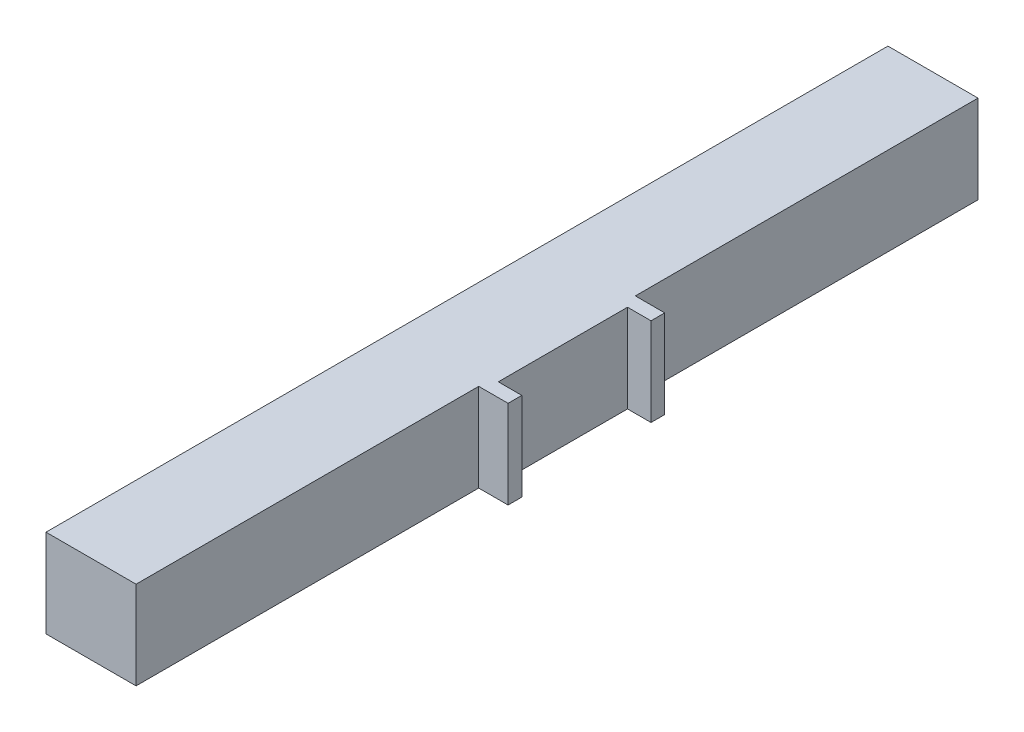
ISO-10303-21;
HEADER;
FILE_DESCRIPTION(('STEP AP214'),'2;1');
FILE_NAME('part.step','',(''),(''),'','','');
FILE_SCHEMA(('AUTOMOTIVE_DESIGN { 1 0 10303 214 1 1 1 1 }'));
ENDSEC;
DATA;
#1=APPLICATION_CONTEXT('core data for automotive mechanical design processes');
#2=APPLICATION_PROTOCOL_DEFINITION('international standard','automotive_design',2000,#1);
#3=PRODUCT_CONTEXT('',#1,'mechanical');
#4=PRODUCT('Part','Part','',(#3));
#5=PRODUCT_RELATED_PRODUCT_CATEGORY('part','',(#4));
#6=PRODUCT_DEFINITION_FORMATION('','',#4);
#7=PRODUCT_DEFINITION_CONTEXT('part definition',#1,'design');
#8=PRODUCT_DEFINITION('design','',#6,#7);
#9=PRODUCT_DEFINITION_SHAPE('','',#8);
#10=(LENGTH_UNIT() NAMED_UNIT(*) SI_UNIT(.MILLI.,.METRE.));
#11=(NAMED_UNIT(*) PLANE_ANGLE_UNIT() SI_UNIT($,.RADIAN.));
#12=(NAMED_UNIT(*) SI_UNIT($,.STERADIAN.) SOLID_ANGLE_UNIT());
#13=UNCERTAINTY_MEASURE_WITH_UNIT(LENGTH_MEASURE(1.E-05),#10,'distance_accuracy_value','');
#14=(GEOMETRIC_REPRESENTATION_CONTEXT(3) GLOBAL_UNCERTAINTY_ASSIGNED_CONTEXT((#13)) GLOBAL_UNIT_ASSIGNED_CONTEXT((#10,
#11,#12)) REPRESENTATION_CONTEXT('',''));
#15=CARTESIAN_POINT('',(0.,0.,0.));
#16=DIRECTION('',(0.,0.,1.));
#17=DIRECTION('',(1.,0.,0.));
#18=AXIS2_PLACEMENT_3D('',#15,#16,#17);
#19=CARTESIAN_POINT('',(38.,0.,0.));
#20=DIRECTION('',(1.,0.,0.));
#21=DIRECTION('',(0.,1.,0.));
#22=AXIS2_PLACEMENT_3D('',#19,#20,#21);
#23=PLANE('',#22);
#24=DIRECTION('',(0.,1.,0.));
#25=VECTOR('',#24,1.);
#26=CARTESIAN_POINT('',(38.,0.,182.));
#27=LINE('',#26,#25);
#28=CARTESIAN_POINT('',(38.,-22.5,182.));
#29=VERTEX_POINT('',#28);
#30=CARTESIAN_POINT('',(38.,22.5,182.));
#31=VERTEX_POINT('',#30);
#32=EDGE_CURVE('E48',#29,#31,#27,.T.);
#33=ORIENTED_EDGE('',*,*,#32,.F.);
#34=DIRECTION('',(0.,0.,-1.));
#35=VECTOR('',#34,1.);
#36=CARTESIAN_POINT('',(38.,-22.5,0.));
#37=LINE('',#36,#35);
#38=CARTESIAN_POINT('',(38.,-22.5,175.));
#39=VERTEX_POINT('',#38);
#40=EDGE_CURVE('E162',#29,#39,#37,.T.);
#41=ORIENTED_EDGE('',*,*,#40,.T.);
#42=DIRECTION('',(0.,-1.,0.));
#43=VECTOR('',#42,1.);
#44=CARTESIAN_POINT('',(38.,0.,175.));
#45=LINE('',#44,#43);
#46=CARTESIAN_POINT('',(38.,22.5,175.));
#47=VERTEX_POINT('',#46);
#48=EDGE_CURVE('E166',#47,#39,#45,.T.);
#49=ORIENTED_EDGE('',*,*,#48,.F.);
#50=DIRECTION('',(0.,0.,1.));
#51=VECTOR('',#50,1.);
#52=CARTESIAN_POINT('',(38.,22.5,0.));
#53=LINE('',#52,#51);
#54=EDGE_CURVE('E157',#47,#31,#53,.T.);
#55=ORIENTED_EDGE('',*,*,#54,.T.);
#56=EDGE_LOOP('',(#33,#41,#49,#55));
#57=FACE_BOUND('',#56,.T.);
#58=ADVANCED_FACE('F40',(#57),#23,.T.);
#59=CARTESIAN_POINT('',(23.,22.5,430.));
#60=DIRECTION('',(-1.,0.,0.));
#61=DIRECTION('',(0.,-1.,0.));
#62=AXIS2_PLACEMENT_3D('',#59,#60,#61);
#63=PLANE('',#62);
#64=DIRECTION('',(0.,-1.,0.));
#65=VECTOR('',#64,1.);
#66=CARTESIAN_POINT('',(23.,0.,255.));
#67=LINE('',#66,#65);
#68=CARTESIAN_POINT('',(23.,22.5,255.));
#69=VERTEX_POINT('',#68);
#70=CARTESIAN_POINT('',(23.,-22.5,255.));
#71=VERTEX_POINT('',#70);
#72=EDGE_CURVE('E156',#69,#71,#67,.T.);
#73=ORIENTED_EDGE('',*,*,#72,.F.);
#74=DIRECTION('',(0.,0.,-1.));
#75=VECTOR('',#74,1.);
#76=CARTESIAN_POINT('',(23.,22.5,430.));
#77=LINE('',#76,#75);
#78=CARTESIAN_POINT('',(23.,22.5,430.));
#79=VERTEX_POINT('',#78);
#80=EDGE_CURVE('E213',#79,#69,#77,.T.);
#81=ORIENTED_EDGE('',*,*,#80,.F.);
#82=DIRECTION('',(0.,1.,0.));
#83=VECTOR('',#82,1.);
#84=CARTESIAN_POINT('',(23.,22.5,430.));
#85=LINE('',#84,#83);
#86=CARTESIAN_POINT('',(23.,-22.5,430.));
#87=VERTEX_POINT('',#86);
#88=EDGE_CURVE('E185',#87,#79,#85,.T.);
#89=ORIENTED_EDGE('',*,*,#88,.F.);
#90=DIRECTION('',(0.,0.,-1.));
#91=VECTOR('',#90,1.);
#92=CARTESIAN_POINT('',(23.,-22.5,430.));
#93=LINE('',#92,#91);
#94=EDGE_CURVE('E204',#87,#71,#93,.T.);
#95=ORIENTED_EDGE('',*,*,#94,.T.);
#96=EDGE_LOOP('',(#73,#81,#89,#95));
#97=FACE_BOUND('',#96,.T.);
#98=ADVANCED_FACE('F247',(#97),#63,.F.);
#99=CARTESIAN_POINT('',(23.,22.5,175.));
#100=VERTEX_POINT('',#99);
#101=CARTESIAN_POINT('',(23.,22.5,0.));
#102=VERTEX_POINT('',#101);
#103=EDGE_CURVE('E212',#100,#102,#77,.T.);
#104=ORIENTED_EDGE('',*,*,#103,.F.);
#105=DIRECTION('',(0.,-1.,0.));
#106=VECTOR('',#105,1.);
#107=CARTESIAN_POINT('',(23.,0.,175.));
#108=LINE('',#107,#106);
#109=CARTESIAN_POINT('',(23.,-22.5,175.));
#110=VERTEX_POINT('',#109);
#111=EDGE_CURVE('E63',#100,#110,#108,.T.);
#112=ORIENTED_EDGE('',*,*,#111,.T.);
#113=CARTESIAN_POINT('',(23.,-22.5,0.));
#114=VERTEX_POINT('',#113);
#115=EDGE_CURVE('E195',#110,#114,#93,.T.);
#116=ORIENTED_EDGE('',*,*,#115,.T.);
#117=DIRECTION('',(0.,1.,0.));
#118=VECTOR('',#117,1.);
#119=CARTESIAN_POINT('',(23.,22.5,0.));
#120=LINE('',#119,#118);
#121=EDGE_CURVE('E184',#114,#102,#120,.T.);
#122=ORIENTED_EDGE('',*,*,#121,.T.);
#123=EDGE_LOOP('',(#104,#112,#116,#122));
#124=FACE_BOUND('',#123,.T.);
#125=ADVANCED_FACE('F42',(#124),#63,.F.);
#126=CARTESIAN_POINT('',(-23.,22.5,430.));
#127=DIRECTION('',(0.,-1.,0.));
#128=DIRECTION('',(0.,0.,-1.));
#129=AXIS2_PLACEMENT_3D('',#126,#127,#128);
#130=PLANE('',#129);
#131=DIRECTION('',(0.,0.,1.));
#132=VECTOR('',#131,1.);
#133=CARTESIAN_POINT('',(26.,22.5,0.));
#134=LINE('',#133,#132);
#135=CARTESIAN_POINT('',(26.,22.5,182.));
#136=VERTEX_POINT('',#135);
#137=CARTESIAN_POINT('',(26.,22.5,248.));
#138=VERTEX_POINT('',#137);
#139=EDGE_CURVE('E137',#136,#138,#134,.T.);
#140=ORIENTED_EDGE('',*,*,#139,.F.);
#141=DIRECTION('',(-1.,0.,0.));
#142=VECTOR('',#141,1.);
#143=CARTESIAN_POINT('',(0.,22.5,182.));
#144=LINE('',#143,#142);
#145=EDGE_CURVE('E134',#31,#136,#144,.T.);
#146=ORIENTED_EDGE('',*,*,#145,.F.);
#147=ORIENTED_EDGE('',*,*,#54,.F.);
#148=DIRECTION('',(-1.,0.,0.));
#149=VECTOR('',#148,1.);
#150=CARTESIAN_POINT('',(38.,22.5,175.));
#151=LINE('',#150,#149);
#152=EDGE_CURVE('E169',#47,#100,#151,.T.);
#153=ORIENTED_EDGE('',*,*,#152,.T.);
#154=ORIENTED_EDGE('',*,*,#103,.T.);
#155=DIRECTION('',(-1.,0.,0.));
#156=VECTOR('',#155,1.);
#157=CARTESIAN_POINT('',(-23.,22.5,0.));
#158=LINE('',#157,#156);
#159=CARTESIAN_POINT('',(-23.,22.5,0.));
#160=VERTEX_POINT('',#159);
#161=EDGE_CURVE('E198',#102,#160,#158,.T.);
#162=ORIENTED_EDGE('',*,*,#161,.T.);
#163=DIRECTION('',(0.,0.,-1.));
#164=VECTOR('',#163,1.);
#165=CARTESIAN_POINT('',(-23.,22.5,430.));
#166=LINE('',#165,#164);
#167=CARTESIAN_POINT('',(-23.,22.5,430.));
#168=VERTEX_POINT('',#167);
#169=EDGE_CURVE('E209',#168,#160,#166,.T.);
#170=ORIENTED_EDGE('',*,*,#169,.F.);
#171=DIRECTION('',(-1.,0.,0.));
#172=VECTOR('',#171,1.);
#173=CARTESIAN_POINT('',(-23.,22.5,430.));
#174=LINE('',#173,#172);
#175=EDGE_CURVE('E188',#79,#168,#174,.T.);
#176=ORIENTED_EDGE('',*,*,#175,.F.);
#177=ORIENTED_EDGE('',*,*,#80,.T.);
#178=DIRECTION('',(-1.,0.,0.));
#179=VECTOR('',#178,1.);
#180=CARTESIAN_POINT('',(38.,22.5,255.));
#181=LINE('',#180,#179);
#182=CARTESIAN_POINT('',(38.,22.5,255.));
#183=VERTEX_POINT('',#182);
#184=EDGE_CURVE('E181',#183,#69,#181,.T.);
#185=ORIENTED_EDGE('',*,*,#184,.F.);
#186=CARTESIAN_POINT('',(38.,22.5,248.));
#187=VERTEX_POINT('',#186);
#188=EDGE_CURVE('E147',#187,#183,#53,.T.);
#189=ORIENTED_EDGE('',*,*,#188,.F.);
#190=DIRECTION('',(1.,0.,0.));
#191=VECTOR('',#190,1.);
#192=CARTESIAN_POINT('',(0.,22.5,248.));
#193=LINE('',#192,#191);
#194=EDGE_CURVE('E55',#138,#187,#193,.T.);
#195=ORIENTED_EDGE('',*,*,#194,.F.);
#196=EDGE_LOOP('',(#140,#146,#147,#153,#154,#162,#170,#176,#177,#185,#189,#195));
#197=FACE_BOUND('',#196,.T.);
#198=ADVANCED_FACE('F145',(#197),#130,.F.);
#199=CARTESIAN_POINT('',(-23.,22.5,430.));
#200=DIRECTION('',(1.,0.,0.));
#201=DIRECTION('',(0.,1.,0.));
#202=AXIS2_PLACEMENT_3D('',#199,#200,#201);
#203=PLANE('',#202);
#204=DIRECTION('',(0.,-1.,0.));
#205=VECTOR('',#204,1.);
#206=CARTESIAN_POINT('',(-23.,22.5,0.));
#207=LINE('',#206,#205);
#208=CARTESIAN_POINT('',(-23.,-22.5,0.));
#209=VERTEX_POINT('',#208);
#210=EDGE_CURVE('E200',#160,#209,#207,.T.);
#211=ORIENTED_EDGE('',*,*,#210,.T.);
#212=DIRECTION('',(0.,0.,-1.));
#213=VECTOR('',#212,1.);
#214=CARTESIAN_POINT('',(-23.,-22.5,430.));
#215=LINE('',#214,#213);
#216=CARTESIAN_POINT('',(-23.,-22.5,430.));
#217=VERTEX_POINT('',#216);
#218=EDGE_CURVE('E206',#217,#209,#215,.T.);
#219=ORIENTED_EDGE('',*,*,#218,.F.);
#220=DIRECTION('',(0.,-1.,0.));
#221=VECTOR('',#220,1.);
#222=CARTESIAN_POINT('',(-23.,22.5,430.));
#223=LINE('',#222,#221);
#224=EDGE_CURVE('E191',#168,#217,#223,.T.);
#225=ORIENTED_EDGE('',*,*,#224,.F.);
#226=ORIENTED_EDGE('',*,*,#169,.T.);
#227=EDGE_LOOP('',(#211,#219,#225,#226));
#228=FACE_BOUND('',#227,.T.);
#229=ADVANCED_FACE('F241',(#228),#203,.F.);
#230=CARTESIAN_POINT('',(-23.,-22.5,430.));
#231=DIRECTION('',(0.,1.,0.));
#232=DIRECTION('',(0.,0.,1.));
#233=AXIS2_PLACEMENT_3D('',#230,#231,#232);
#234=PLANE('',#233);
#235=ORIENTED_EDGE('',*,*,#40,.F.);
#236=DIRECTION('',(-1.,0.,0.));
#237=VECTOR('',#236,1.);
#238=CARTESIAN_POINT('',(-23.,-22.5,182.));
#239=LINE('',#238,#237);
#240=CARTESIAN_POINT('',(26.,-22.5,182.));
#241=VERTEX_POINT('',#240);
#242=EDGE_CURVE('E153',#29,#241,#239,.T.);
#243=ORIENTED_EDGE('',*,*,#242,.T.);
#244=DIRECTION('',(0.,0.,1.));
#245=VECTOR('',#244,1.);
#246=CARTESIAN_POINT('',(26.,-22.5,430.));
#247=LINE('',#246,#245);
#248=CARTESIAN_POINT('',(26.,-22.5,248.));
#249=VERTEX_POINT('',#248);
#250=EDGE_CURVE('E11',#241,#249,#247,.T.);
#251=ORIENTED_EDGE('',*,*,#250,.T.);
#252=DIRECTION('',(1.,0.,0.));
#253=VECTOR('',#252,1.);
#254=CARTESIAN_POINT('',(-23.,-22.5,248.));
#255=LINE('',#254,#253);
#256=CARTESIAN_POINT('',(38.,-22.5,248.));
#257=VERTEX_POINT('',#256);
#258=EDGE_CURVE('E131',#249,#257,#255,.T.);
#259=ORIENTED_EDGE('',*,*,#258,.T.);
#260=CARTESIAN_POINT('',(38.,-22.5,255.));
#261=VERTEX_POINT('',#260);
#262=EDGE_CURVE('E163',#261,#257,#37,.T.);
#263=ORIENTED_EDGE('',*,*,#262,.F.);
#264=DIRECTION('',(-1.,0.,0.));
#265=VECTOR('',#264,1.);
#266=CARTESIAN_POINT('',(38.,-22.5,255.));
#267=LINE('',#266,#265);
#268=EDGE_CURVE('E178',#261,#71,#267,.T.);
#269=ORIENTED_EDGE('',*,*,#268,.T.);
#270=ORIENTED_EDGE('',*,*,#94,.F.);
#271=DIRECTION('',(1.,0.,0.));
#272=VECTOR('',#271,1.);
#273=CARTESIAN_POINT('',(-23.,-22.5,430.));
#274=LINE('',#273,#272);
#275=EDGE_CURVE('E193',#217,#87,#274,.T.);
#276=ORIENTED_EDGE('',*,*,#275,.F.);
#277=ORIENTED_EDGE('',*,*,#218,.T.);
#278=DIRECTION('',(1.,0.,0.));
#279=VECTOR('',#278,1.);
#280=CARTESIAN_POINT('',(-23.,-22.5,0.));
#281=LINE('',#280,#279);
#282=EDGE_CURVE('E189',#209,#114,#281,.T.);
#283=ORIENTED_EDGE('',*,*,#282,.T.);
#284=ORIENTED_EDGE('',*,*,#115,.F.);
#285=DIRECTION('',(-1.,0.,0.));
#286=VECTOR('',#285,1.);
#287=CARTESIAN_POINT('',(38.,-22.5,175.));
#288=LINE('',#287,#286);
#289=EDGE_CURVE('E175',#39,#110,#288,.T.);
#290=ORIENTED_EDGE('',*,*,#289,.F.);
#291=EDGE_LOOP('',(#235,#243,#251,#259,#263,#269,#270,#276,#277,#283,#284,#290));
#292=FACE_BOUND('',#291,.T.);
#293=ADVANCED_FACE('F235',(#292),#234,.F.);
#294=CARTESIAN_POINT('',(0.,0.,430.));
#295=DIRECTION('',(0.,0.,1.));
#296=DIRECTION('',(1.,0.,0.));
#297=AXIS2_PLACEMENT_3D('',#294,#295,#296);
#298=PLANE('',#297);
#299=ORIENTED_EDGE('',*,*,#88,.T.);
#300=ORIENTED_EDGE('',*,*,#175,.T.);
#301=ORIENTED_EDGE('',*,*,#224,.T.);
#302=ORIENTED_EDGE('',*,*,#275,.T.);
#303=EDGE_LOOP('',(#299,#300,#301,#302));
#304=FACE_BOUND('',#303,.T.);
#305=ADVANCED_FACE('F245',(#304),#298,.T.);
#306=CARTESIAN_POINT('',(0.,0.,0.));
#307=DIRECTION('',(0.,0.,1.));
#308=DIRECTION('',(1.,0.,0.));
#309=AXIS2_PLACEMENT_3D('',#306,#307,#308);
#310=PLANE('',#309);
#311=ORIENTED_EDGE('',*,*,#121,.F.);
#312=ORIENTED_EDGE('',*,*,#282,.F.);
#313=ORIENTED_EDGE('',*,*,#210,.F.);
#314=ORIENTED_EDGE('',*,*,#161,.F.);
#315=EDGE_LOOP('',(#311,#312,#313,#314));
#316=FACE_BOUND('',#315,.T.);
#317=ADVANCED_FACE('F232',(#316),#310,.F.);
#318=CARTESIAN_POINT('',(38.,0.,255.));
#319=DIRECTION('',(0.,0.,-1.));
#320=DIRECTION('',(-1.,0.,0.));
#321=AXIS2_PLACEMENT_3D('',#318,#319,#320);
#322=PLANE('',#321);
#323=ORIENTED_EDGE('',*,*,#72,.T.);
#324=ORIENTED_EDGE('',*,*,#268,.F.);
#325=DIRECTION('',(0.,-1.,0.));
#326=VECTOR('',#325,1.);
#327=CARTESIAN_POINT('',(38.,0.,255.));
#328=LINE('',#327,#326);
#329=EDGE_CURVE('E160',#183,#261,#328,.T.);
#330=ORIENTED_EDGE('',*,*,#329,.F.);
#331=ORIENTED_EDGE('',*,*,#184,.T.);
#332=EDGE_LOOP('',(#323,#324,#330,#331));
#333=FACE_BOUND('',#332,.T.);
#334=ADVANCED_FACE('F250',(#333),#322,.F.);
#335=CARTESIAN_POINT('',(38.,0.,175.));
#336=DIRECTION('',(0.,0.,-1.));
#337=DIRECTION('',(-1.,0.,0.));
#338=AXIS2_PLACEMENT_3D('',#335,#336,#337);
#339=PLANE('',#338);
#340=ORIENTED_EDGE('',*,*,#111,.F.);
#341=ORIENTED_EDGE('',*,*,#152,.F.);
#342=ORIENTED_EDGE('',*,*,#48,.T.);
#343=ORIENTED_EDGE('',*,*,#289,.T.);
#344=EDGE_LOOP('',(#340,#341,#342,#343));
#345=FACE_BOUND('',#344,.T.);
#346=ADVANCED_FACE('F226',(#345),#339,.T.);
#347=DIRECTION('',(0.,-1.,0.));
#348=VECTOR('',#347,1.);
#349=CARTESIAN_POINT('',(38.,0.,248.));
#350=LINE('',#349,#348);
#351=EDGE_CURVE('E216',#187,#257,#350,.T.);
#352=ORIENTED_EDGE('',*,*,#351,.F.);
#353=ORIENTED_EDGE('',*,*,#188,.T.);
#354=ORIENTED_EDGE('',*,*,#329,.T.);
#355=ORIENTED_EDGE('',*,*,#262,.T.);
#356=EDGE_LOOP('',(#352,#353,#354,#355));
#357=FACE_BOUND('',#356,.T.);
#358=ADVANCED_FACE('F254',(#357),#23,.T.);
#359=CARTESIAN_POINT('',(26.,-3411.5,0.));
#360=DIRECTION('',(-1.,0.,0.));
#361=DIRECTION('',(0.,0.,1.));
#362=AXIS2_PLACEMENT_3D('',#359,#360,#361);
#363=PLANE('',#362);
#364=DIRECTION('',(0.,1.,0.));
#365=VECTOR('',#364,1.);
#366=CARTESIAN_POINT('',(26.,-3411.5,182.));
#367=LINE('',#366,#365);
#368=EDGE_CURVE('E133',#241,#136,#367,.T.);
#369=ORIENTED_EDGE('',*,*,#368,.T.);
#370=ORIENTED_EDGE('',*,*,#139,.T.);
#371=DIRECTION('',(0.,1.,0.));
#372=VECTOR('',#371,1.);
#373=CARTESIAN_POINT('',(26.,-3411.5,248.));
#374=LINE('',#373,#372);
#375=EDGE_CURVE('E127',#249,#138,#374,.T.);
#376=ORIENTED_EDGE('',*,*,#375,.F.);
#377=ORIENTED_EDGE('',*,*,#250,.F.);
#378=EDGE_LOOP('',(#369,#370,#376,#377));
#379=FACE_BOUND('',#378,.T.);
#380=ADVANCED_FACE('F138',(#379),#363,.F.);
#381=CARTESIAN_POINT('',(0.,-3411.5,182.));
#382=DIRECTION('',(0.,0.,-1.));
#383=DIRECTION('',(-1.,0.,0.));
#384=AXIS2_PLACEMENT_3D('',#381,#382,#383);
#385=PLANE('',#384);
#386=ORIENTED_EDGE('',*,*,#32,.T.);
#387=ORIENTED_EDGE('',*,*,#145,.T.);
#388=ORIENTED_EDGE('',*,*,#368,.F.);
#389=ORIENTED_EDGE('',*,*,#242,.F.);
#390=EDGE_LOOP('',(#386,#387,#388,#389));
#391=FACE_BOUND('',#390,.T.);
#392=ADVANCED_FACE('F219',(#391),#385,.F.);
#393=CARTESIAN_POINT('',(0.,-3411.5,248.));
#394=DIRECTION('',(0.,0.,1.));
#395=DIRECTION('',(1.,0.,0.));
#396=AXIS2_PLACEMENT_3D('',#393,#394,#395);
#397=PLANE('',#396);
#398=ORIENTED_EDGE('',*,*,#375,.T.);
#399=ORIENTED_EDGE('',*,*,#194,.T.);
#400=ORIENTED_EDGE('',*,*,#351,.T.);
#401=ORIENTED_EDGE('',*,*,#258,.F.);
#402=EDGE_LOOP('',(#398,#399,#400,#401));
#403=FACE_BOUND('',#402,.T.);
#404=ADVANCED_FACE('F129',(#403),#397,.F.);
#405=CLOSED_SHELL('',(#58,#98,#125,#198,#229,#293,#305,#317,#334,#346,#358,#380,#392,#404));
#406=MANIFOLD_SOLID_BREP('B2',#405);
#407=ADVANCED_BREP_SHAPE_REPRESENTATION('',(#18,#406),#14);
#408=SHAPE_DEFINITION_REPRESENTATION(#9,#407);
ENDSEC;
END-ISO-10303-21;
